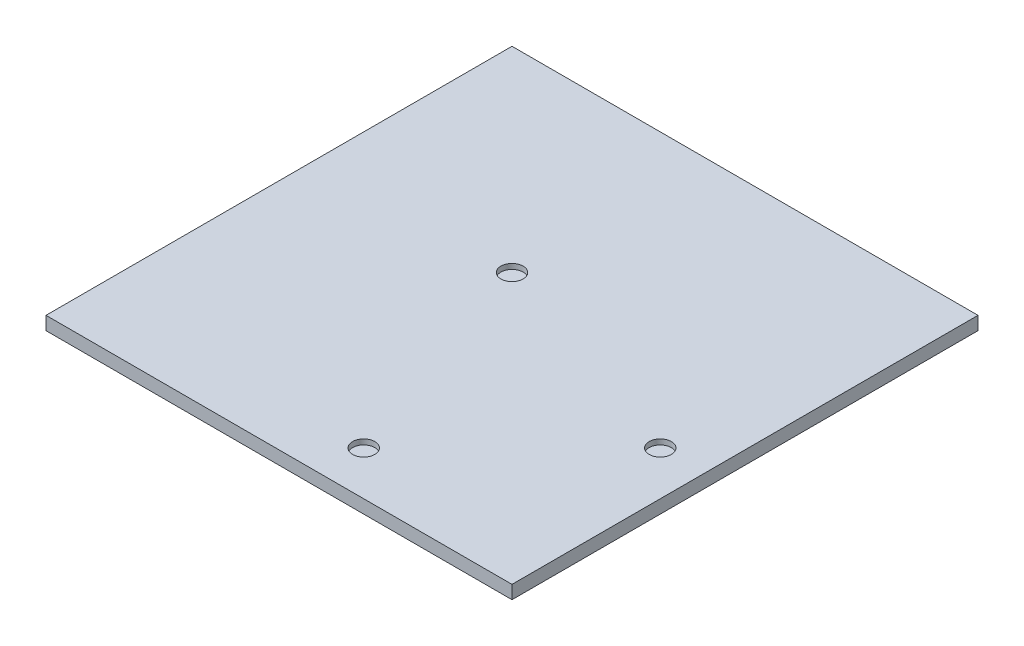
ISO-10303-21;
HEADER;
FILE_DESCRIPTION(('STEP AP214'),'2;1');
FILE_NAME('part.step','',(''),(''),'','','');
FILE_SCHEMA(('AUTOMOTIVE_DESIGN { 1 0 10303 214 1 1 1 1 }'));
ENDSEC;
DATA;
#1=APPLICATION_CONTEXT('core data for automotive mechanical design processes');
#2=APPLICATION_PROTOCOL_DEFINITION('international standard','automotive_design',2000,#1);
#3=PRODUCT_CONTEXT('',#1,'mechanical');
#4=PRODUCT('Part','Part','',(#3));
#5=PRODUCT_RELATED_PRODUCT_CATEGORY('part','',(#4));
#6=PRODUCT_DEFINITION_FORMATION('','',#4);
#7=PRODUCT_DEFINITION_CONTEXT('part definition',#1,'design');
#8=PRODUCT_DEFINITION('design','',#6,#7);
#9=PRODUCT_DEFINITION_SHAPE('','',#8);
#10=(LENGTH_UNIT() NAMED_UNIT(*) SI_UNIT(.MILLI.,.METRE.));
#11=(NAMED_UNIT(*) PLANE_ANGLE_UNIT() SI_UNIT($,.RADIAN.));
#12=(NAMED_UNIT(*) SI_UNIT($,.STERADIAN.) SOLID_ANGLE_UNIT());
#13=UNCERTAINTY_MEASURE_WITH_UNIT(LENGTH_MEASURE(1.E-05),#10,'distance_accuracy_value','');
#14=(GEOMETRIC_REPRESENTATION_CONTEXT(3) GLOBAL_UNCERTAINTY_ASSIGNED_CONTEXT((#13)) GLOBAL_UNIT_ASSIGNED_CONTEXT((#10,
#11,#12)) REPRESENTATION_CONTEXT('',''));
#15=CARTESIAN_POINT('',(0.,0.,0.));
#16=DIRECTION('',(0.,0.,1.));
#17=DIRECTION('',(1.,0.,0.));
#18=AXIS2_PLACEMENT_3D('',#15,#16,#17);
#19=CARTESIAN_POINT('',(44.45,2.54,44.45));
#20=DIRECTION('',(-1.,0.,0.));
#21=DIRECTION('',(0.,0.,1.));
#22=AXIS2_PLACEMENT_3D('',#19,#20,#21);
#23=PLANE('',#22);
#24=DIRECTION('',(0.,0.,-1.));
#25=VECTOR('',#24,1.);
#26=CARTESIAN_POINT('',(44.45,0.,44.45));
#27=LINE('',#26,#25);
#28=CARTESIAN_POINT('',(44.45,0.,44.45));
#29=VERTEX_POINT('',#28);
#30=CARTESIAN_POINT('',(44.45,0.,-44.45));
#31=VERTEX_POINT('',#30);
#32=EDGE_CURVE('E99',#29,#31,#27,.T.);
#33=ORIENTED_EDGE('',*,*,#32,.T.);
#34=DIRECTION('',(0.,-1.,0.));
#35=VECTOR('',#34,1.);
#36=CARTESIAN_POINT('',(44.45,2.54,-44.45));
#37=LINE('',#36,#35);
#38=CARTESIAN_POINT('',(44.45,2.54,-44.45));
#39=VERTEX_POINT('',#38);
#40=EDGE_CURVE('E11',#39,#31,#37,.T.);
#41=ORIENTED_EDGE('',*,*,#40,.F.);
#42=DIRECTION('',(0.,0.,-1.));
#43=VECTOR('',#42,1.);
#44=CARTESIAN_POINT('',(44.45,2.54,44.45));
#45=LINE('',#44,#43);
#46=CARTESIAN_POINT('',(44.45,2.54,44.45));
#47=VERTEX_POINT('',#46);
#48=EDGE_CURVE('E87',#47,#39,#45,.T.);
#49=ORIENTED_EDGE('',*,*,#48,.F.);
#50=DIRECTION('',(0.,-1.,0.));
#51=VECTOR('',#50,1.);
#52=CARTESIAN_POINT('',(44.45,2.54,44.45));
#53=LINE('',#52,#51);
#54=EDGE_CURVE('E95',#47,#29,#53,.T.);
#55=ORIENTED_EDGE('',*,*,#54,.T.);
#56=EDGE_LOOP('',(#33,#41,#49,#55));
#57=FACE_BOUND('',#56,.T.);
#58=ADVANCED_FACE('F36',(#57),#23,.F.);
#59=CARTESIAN_POINT('',(-44.45,2.54,-44.45));
#60=DIRECTION('',(0.,0.,1.));
#61=DIRECTION('',(1.,0.,0.));
#62=AXIS2_PLACEMENT_3D('',#59,#60,#61);
#63=PLANE('',#62);
#64=DIRECTION('',(-1.,0.,0.));
#65=VECTOR('',#64,1.);
#66=CARTESIAN_POINT('',(-44.45,0.,-44.45));
#67=LINE('',#66,#65);
#68=CARTESIAN_POINT('',(-44.45,0.,-44.45));
#69=VERTEX_POINT('',#68);
#70=EDGE_CURVE('E91',#31,#69,#67,.T.);
#71=ORIENTED_EDGE('',*,*,#70,.T.);
#72=DIRECTION('',(0.,-1.,0.));
#73=VECTOR('',#72,1.);
#74=CARTESIAN_POINT('',(-44.45,2.54,-44.45));
#75=LINE('',#74,#73);
#76=CARTESIAN_POINT('',(-44.45,2.54,-44.45));
#77=VERTEX_POINT('',#76);
#78=EDGE_CURVE('E44',#77,#69,#75,.T.);
#79=ORIENTED_EDGE('',*,*,#78,.F.);
#80=DIRECTION('',(-1.,0.,0.));
#81=VECTOR('',#80,1.);
#82=CARTESIAN_POINT('',(-44.45,2.54,-44.45));
#83=LINE('',#82,#81);
#84=EDGE_CURVE('E82',#39,#77,#83,.T.);
#85=ORIENTED_EDGE('',*,*,#84,.F.);
#86=ORIENTED_EDGE('',*,*,#40,.T.);
#87=EDGE_LOOP('',(#71,#79,#85,#86));
#88=FACE_BOUND('',#87,.T.);
#89=ADVANCED_FACE('F90',(#88),#63,.F.);
#90=CARTESIAN_POINT('',(-44.45,2.54,44.45));
#91=DIRECTION('',(1.,0.,0.));
#92=DIRECTION('',(0.,0.,-1.));
#93=AXIS2_PLACEMENT_3D('',#90,#91,#92);
#94=PLANE('',#93);
#95=DIRECTION('',(0.,0.,1.));
#96=VECTOR('',#95,1.);
#97=CARTESIAN_POINT('',(-44.45,0.,44.45));
#98=LINE('',#97,#96);
#99=CARTESIAN_POINT('',(-44.45,0.,44.45));
#100=VERTEX_POINT('',#99);
#101=EDGE_CURVE('E69',#69,#100,#98,.T.);
#102=ORIENTED_EDGE('',*,*,#101,.T.);
#103=DIRECTION('',(0.,-1.,0.));
#104=VECTOR('',#103,1.);
#105=CARTESIAN_POINT('',(-44.45,2.54,44.45));
#106=LINE('',#105,#104);
#107=CARTESIAN_POINT('',(-44.45,2.54,44.45));
#108=VERTEX_POINT('',#107);
#109=EDGE_CURVE('E92',#108,#100,#106,.T.);
#110=ORIENTED_EDGE('',*,*,#109,.F.);
#111=DIRECTION('',(0.,0.,1.));
#112=VECTOR('',#111,1.);
#113=CARTESIAN_POINT('',(-44.45,2.54,44.45));
#114=LINE('',#113,#112);
#115=EDGE_CURVE('E85',#77,#108,#114,.T.);
#116=ORIENTED_EDGE('',*,*,#115,.F.);
#117=ORIENTED_EDGE('',*,*,#78,.T.);
#118=EDGE_LOOP('',(#102,#110,#116,#117));
#119=FACE_BOUND('',#118,.T.);
#120=ADVANCED_FACE('F93',(#119),#94,.F.);
#121=CARTESIAN_POINT('',(-44.45,2.54,44.45));
#122=DIRECTION('',(0.,0.,-1.));
#123=DIRECTION('',(-1.,0.,0.));
#124=AXIS2_PLACEMENT_3D('',#121,#122,#123);
#125=PLANE('',#124);
#126=DIRECTION('',(1.,0.,0.));
#127=VECTOR('',#126,1.);
#128=CARTESIAN_POINT('',(-44.45,0.,44.45));
#129=LINE('',#128,#127);
#130=EDGE_CURVE('E75',#100,#29,#129,.T.);
#131=ORIENTED_EDGE('',*,*,#130,.T.);
#132=ORIENTED_EDGE('',*,*,#54,.F.);
#133=DIRECTION('',(1.,0.,0.));
#134=VECTOR('',#133,1.);
#135=CARTESIAN_POINT('',(-44.45,2.54,44.45));
#136=LINE('',#135,#134);
#137=EDGE_CURVE('E52',#108,#47,#136,.T.);
#138=ORIENTED_EDGE('',*,*,#137,.F.);
#139=ORIENTED_EDGE('',*,*,#109,.T.);
#140=EDGE_LOOP('',(#131,#132,#138,#139));
#141=FACE_BOUND('',#140,.T.);
#142=ADVANCED_FACE('F107',(#141),#125,.F.);
#143=CARTESIAN_POINT('',(0.,2.54,0.));
#144=DIRECTION('',(0.,-1.,0.));
#145=DIRECTION('',(0.,0.,-1.));
#146=AXIS2_PLACEMENT_3D('',#143,#144,#145);
#147=PLANE('',#146);
#148=CARTESIAN_POINT('',(-7.07106781186547,2.54,-7.07106781186548));
#149=DIRECTION('',(0.,1.,0.));
#150=DIRECTION('',(0.,0.,1.));
#151=AXIS2_PLACEMENT_3D('',#148,#149,#150);
#152=CIRCLE('',#151,2.125);
#153=CARTESIAN_POINT('',(-7.07106781186547,2.54,-4.94606781186548));
#154=VERTEX_POINT('',#153);
#155=EDGE_CURVE('E125',#154,#154,#152,.T.);
#156=ORIENTED_EDGE('',*,*,#155,.F.);
#157=EDGE_LOOP('',(#156));
#158=FACE_BOUND('',#157,.T.);
#159=CARTESIAN_POINT('',(36.0624458405139,2.54,7.77817459305202));
#160=DIRECTION('',(0.,1.,0.));
#161=DIRECTION('',(0.,0.,1.));
#162=AXIS2_PLACEMENT_3D('',#159,#160,#161);
#163=CIRCLE('',#162,2.125);
#164=CARTESIAN_POINT('',(36.0624458405139,2.54,9.90317459305202));
#165=VERTEX_POINT('',#164);
#166=EDGE_CURVE('E119',#165,#165,#163,.T.);
#167=ORIENTED_EDGE('',*,*,#166,.F.);
#168=EDGE_LOOP('',(#167));
#169=FACE_BOUND('',#168,.T.);
#170=CARTESIAN_POINT('',(7.77817459305203,2.54,36.0624458405139));
#171=DIRECTION('',(0.,1.,0.));
#172=DIRECTION('',(0.,0.,1.));
#173=AXIS2_PLACEMENT_3D('',#170,#171,#172);
#174=CIRCLE('',#173,2.125);
#175=CARTESIAN_POINT('',(7.77817459305203,2.54,38.1874458405139));
#176=VERTEX_POINT('',#175);
#177=EDGE_CURVE('E113',#176,#176,#174,.T.);
#178=ORIENTED_EDGE('',*,*,#177,.F.);
#179=EDGE_LOOP('',(#178));
#180=FACE_BOUND('',#179,.T.);
#181=ORIENTED_EDGE('',*,*,#48,.T.);
#182=ORIENTED_EDGE('',*,*,#84,.T.);
#183=ORIENTED_EDGE('',*,*,#115,.T.);
#184=ORIENTED_EDGE('',*,*,#137,.T.);
#185=EDGE_LOOP('',(#181,#182,#183,#184));
#186=FACE_BOUND('',#185,.T.);
#187=ADVANCED_FACE('F83',(#158,#169,#180,#186),#147,.F.);
#188=CARTESIAN_POINT('',(0.,0.,0.));
#189=DIRECTION('',(0.,-1.,0.));
#190=DIRECTION('',(0.,0.,-1.));
#191=AXIS2_PLACEMENT_3D('',#188,#189,#190);
#192=PLANE('',#191);
#193=ORIENTED_EDGE('',*,*,#32,.F.);
#194=ORIENTED_EDGE('',*,*,#130,.F.);
#195=ORIENTED_EDGE('',*,*,#101,.F.);
#196=ORIENTED_EDGE('',*,*,#70,.F.);
#197=EDGE_LOOP('',(#193,#194,#195,#196));
#198=FACE_BOUND('',#197,.T.);
#199=ADVANCED_FACE('F110',(#198),#192,.T.);
#200=CARTESIAN_POINT('',(7.77817459305203,1.54,36.0624458405139));
#201=DIRECTION('',(0.,1.,0.));
#202=DIRECTION('',(0.,0.,1.));
#203=AXIS2_PLACEMENT_3D('',#200,#201,#202);
#204=CYLINDRICAL_SURFACE('',#203,2.125);
#205=CARTESIAN_POINT('',(7.77817459305203,1.54,36.0624458405139));
#206=DIRECTION('',(0.,1.,0.));
#207=DIRECTION('',(0.,0.,1.));
#208=AXIS2_PLACEMENT_3D('',#205,#206,#207);
#209=CIRCLE('',#208,2.125);
#210=CARTESIAN_POINT('',(7.77817459305203,1.54,38.1874458405139));
#211=VERTEX_POINT('',#210);
#212=EDGE_CURVE('E116',#211,#211,#209,.T.);
#213=ORIENTED_EDGE('',*,*,#212,.F.);
#214=EDGE_LOOP('',(#213));
#215=FACE_BOUND('',#214,.T.);
#216=ORIENTED_EDGE('',*,*,#177,.T.);
#217=EDGE_LOOP('',(#216));
#218=FACE_BOUND('',#217,.T.);
#219=ADVANCED_FACE('F147',(#215,#218),#204,.F.);
#220=CARTESIAN_POINT('',(0.,1.54,0.));
#221=DIRECTION('',(0.,1.,0.));
#222=DIRECTION('',(0.,0.,1.));
#223=AXIS2_PLACEMENT_3D('',#220,#221,#222);
#224=PLANE('',#223);
#225=ORIENTED_EDGE('',*,*,#212,.T.);
#226=EDGE_LOOP('',(#225));
#227=FACE_BOUND('',#226,.T.);
#228=ADVANCED_FACE('F149',(#227),#224,.T.);
#229=CARTESIAN_POINT('',(36.0624458405139,1.54,7.77817459305202));
#230=DIRECTION('',(0.,1.,0.));
#231=DIRECTION('',(0.,0.,1.));
#232=AXIS2_PLACEMENT_3D('',#229,#230,#231);
#233=CYLINDRICAL_SURFACE('',#232,2.125);
#234=CARTESIAN_POINT('',(36.0624458405139,1.54,7.77817459305202));
#235=DIRECTION('',(0.,1.,0.));
#236=DIRECTION('',(0.,0.,1.));
#237=AXIS2_PLACEMENT_3D('',#234,#235,#236);
#238=CIRCLE('',#237,2.125);
#239=CARTESIAN_POINT('',(36.0624458405139,1.54,9.90317459305202));
#240=VERTEX_POINT('',#239);
#241=EDGE_CURVE('E122',#240,#240,#238,.T.);
#242=ORIENTED_EDGE('',*,*,#241,.F.);
#243=EDGE_LOOP('',(#242));
#244=FACE_BOUND('',#243,.T.);
#245=ORIENTED_EDGE('',*,*,#166,.T.);
#246=EDGE_LOOP('',(#245));
#247=FACE_BOUND('',#246,.T.);
#248=ADVANCED_FACE('F156',(#244,#247),#233,.F.);
#249=CARTESIAN_POINT('',(0.,1.54,0.));
#250=DIRECTION('',(0.,1.,0.));
#251=DIRECTION('',(0.,0.,1.));
#252=AXIS2_PLACEMENT_3D('',#249,#250,#251);
#253=PLANE('',#252);
#254=ORIENTED_EDGE('',*,*,#241,.T.);
#255=EDGE_LOOP('',(#254));
#256=FACE_BOUND('',#255,.T.);
#257=ADVANCED_FACE('F136',(#256),#253,.T.);
#258=CARTESIAN_POINT('',(-7.07106781186547,1.54,-7.07106781186548));
#259=DIRECTION('',(0.,1.,0.));
#260=DIRECTION('',(0.,0.,1.));
#261=AXIS2_PLACEMENT_3D('',#258,#259,#260);
#262=CYLINDRICAL_SURFACE('',#261,2.125);
#263=CARTESIAN_POINT('',(-7.07106781186547,1.54,-7.07106781186548));
#264=DIRECTION('',(0.,1.,0.));
#265=DIRECTION('',(0.,0.,1.));
#266=AXIS2_PLACEMENT_3D('',#263,#264,#265);
#267=CIRCLE('',#266,2.125);
#268=CARTESIAN_POINT('',(-7.07106781186547,1.54,-4.94606781186548));
#269=VERTEX_POINT('',#268);
#270=EDGE_CURVE('E102',#269,#269,#267,.T.);
#271=ORIENTED_EDGE('',*,*,#270,.F.);
#272=EDGE_LOOP('',(#271));
#273=FACE_BOUND('',#272,.T.);
#274=ORIENTED_EDGE('',*,*,#155,.T.);
#275=EDGE_LOOP('',(#274));
#276=FACE_BOUND('',#275,.T.);
#277=ADVANCED_FACE('F133',(#273,#276),#262,.F.);
#278=CARTESIAN_POINT('',(0.,1.54,0.));
#279=DIRECTION('',(0.,1.,0.));
#280=DIRECTION('',(0.,0.,1.));
#281=AXIS2_PLACEMENT_3D('',#278,#279,#280);
#282=PLANE('',#281);
#283=ORIENTED_EDGE('',*,*,#270,.T.);
#284=EDGE_LOOP('',(#283));
#285=FACE_BOUND('',#284,.T.);
#286=ADVANCED_FACE('F131',(#285),#282,.T.);
#287=CLOSED_SHELL('',(#58,#89,#120,#142,#187,#199,#219,#228,#248,#257,#277,#286));
#288=MANIFOLD_SOLID_BREP('B2',#287);
#289=ADVANCED_BREP_SHAPE_REPRESENTATION('',(#18,#288),#14);
#290=SHAPE_DEFINITION_REPRESENTATION(#9,#289);
ENDSEC;
END-ISO-10303-21;
